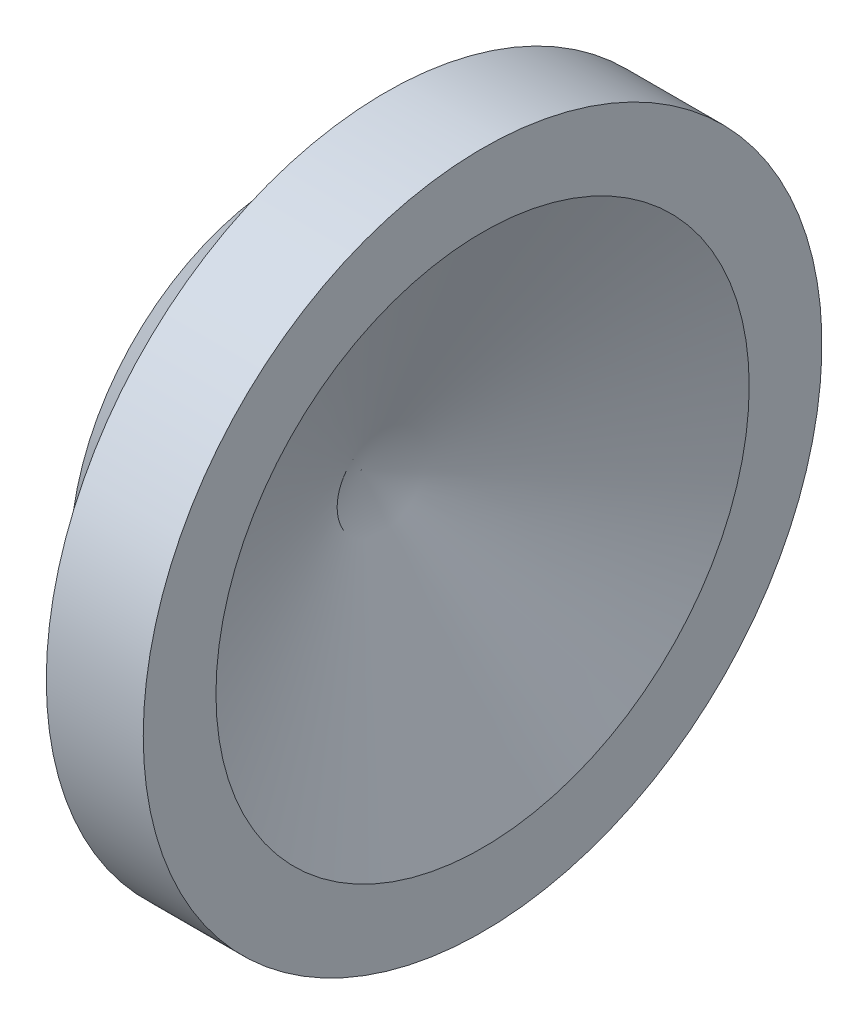
ISO-10303-21;
HEADER;
FILE_DESCRIPTION(('STEP AP214'),'2;1');
FILE_NAME('part.step','',(''),(''),'','','');
FILE_SCHEMA(('AUTOMOTIVE_DESIGN { 1 0 10303 214 1 1 1 1 }'));
ENDSEC;
DATA;
#1=APPLICATION_CONTEXT('core data for automotive mechanical design processes');
#2=APPLICATION_PROTOCOL_DEFINITION('international standard','automotive_design',2000,#1);
#3=PRODUCT_CONTEXT('',#1,'mechanical');
#4=PRODUCT('Part','Part','',(#3));
#5=PRODUCT_RELATED_PRODUCT_CATEGORY('part','',(#4));
#6=PRODUCT_DEFINITION_FORMATION('','',#4);
#7=PRODUCT_DEFINITION_CONTEXT('part definition',#1,'design');
#8=PRODUCT_DEFINITION('design','',#6,#7);
#9=PRODUCT_DEFINITION_SHAPE('','',#8);
#10=(LENGTH_UNIT() NAMED_UNIT(*) SI_UNIT(.MILLI.,.METRE.));
#11=(NAMED_UNIT(*) PLANE_ANGLE_UNIT() SI_UNIT($,.RADIAN.));
#12=(NAMED_UNIT(*) SI_UNIT($,.STERADIAN.) SOLID_ANGLE_UNIT());
#13=UNCERTAINTY_MEASURE_WITH_UNIT(LENGTH_MEASURE(1.E-05),#10,'distance_accuracy_value','');
#14=(GEOMETRIC_REPRESENTATION_CONTEXT(3) GLOBAL_UNCERTAINTY_ASSIGNED_CONTEXT((#13)) GLOBAL_UNIT_ASSIGNED_CONTEXT((#10,
#11,#12)) REPRESENTATION_CONTEXT('',''));
#15=CARTESIAN_POINT('',(0.,0.,0.));
#16=DIRECTION('',(0.,0.,1.));
#17=DIRECTION('',(1.,0.,0.));
#18=AXIS2_PLACEMENT_3D('',#15,#16,#17);
#19=CARTESIAN_POINT('',(0.,0.,1.5));
#20=DIRECTION('',(-1.,0.,0.));
#21=DIRECTION('',(0.,0.,1.));
#22=AXIS2_PLACEMENT_3D('',#19,#20,#21);
#23=PLANE('',#22);
#24=CARTESIAN_POINT('',(0.,0.,-2.));
#25=DIRECTION('',(-1.,0.,0.));
#26=DIRECTION('',(0.,0.,1.));
#27=AXIS2_PLACEMENT_3D('',#24,#25,#26);
#28=CIRCLE('',#27,3.5);
#29=CARTESIAN_POINT('',(0.,0.,1.5));
#30=VERTEX_POINT('',#29);
#31=EDGE_CURVE('E11',#30,#30,#28,.T.);
#32=ORIENTED_EDGE('',*,*,#31,.T.);
#33=EDGE_LOOP('',(#32));
#34=FACE_BOUND('',#33,.T.);
#35=CARTESIAN_POINT('',(0.,0.,-2.));
#36=DIRECTION('',(-1.,0.,0.));
#37=DIRECTION('',(0.,0.,1.));
#38=AXIS2_PLACEMENT_3D('',#35,#36,#37);
#39=CIRCLE('',#38,2.);
#40=CARTESIAN_POINT('',(0.,0.,0.));
#41=VERTEX_POINT('',#40);
#42=EDGE_CURVE('E65',#41,#41,#39,.T.);
#43=ORIENTED_EDGE('',*,*,#42,.F.);
#44=EDGE_LOOP('',(#43));
#45=FACE_BOUND('',#44,.T.);
#46=ADVANCED_FACE('F37',(#34,#45),#23,.T.);
#47=CARTESIAN_POINT('',(-1.,0.,-2.));
#48=DIRECTION('',(-1.,0.,0.));
#49=DIRECTION('',(0.,0.,1.));
#50=AXIS2_PLACEMENT_3D('',#47,#48,#49);
#51=CYLINDRICAL_SURFACE('',#50,3.5);
#52=CARTESIAN_POINT('',(1.,0.,-2.));
#53=DIRECTION('',(-1.,0.,0.));
#54=DIRECTION('',(0.,0.,1.));
#55=AXIS2_PLACEMENT_3D('',#52,#53,#54);
#56=CIRCLE('',#55,3.5);
#57=CARTESIAN_POINT('',(1.,0.,1.5));
#58=VERTEX_POINT('',#57);
#59=EDGE_CURVE('E43',#58,#58,#56,.T.);
#60=ORIENTED_EDGE('',*,*,#59,.T.);
#61=EDGE_LOOP('',(#60));
#62=FACE_BOUND('',#61,.T.);
#63=ORIENTED_EDGE('',*,*,#31,.F.);
#64=EDGE_LOOP('',(#63));
#65=FACE_BOUND('',#64,.T.);
#66=ADVANCED_FACE('F73',(#62,#65),#51,.T.);
#67=CARTESIAN_POINT('',(1.,0.,0.75));
#68=DIRECTION('',(1.,0.,0.));
#69=DIRECTION('',(0.,0.,-1.));
#70=AXIS2_PLACEMENT_3D('',#67,#68,#69);
#71=PLANE('',#70);
#72=CARTESIAN_POINT('',(1.,0.,-2.));
#73=DIRECTION('',(-1.,0.,0.));
#74=DIRECTION('',(0.,0.,1.));
#75=AXIS2_PLACEMENT_3D('',#72,#73,#74);
#76=CIRCLE('',#75,2.75);
#77=CARTESIAN_POINT('',(1.,0.,0.75));
#78=VERTEX_POINT('',#77);
#79=EDGE_CURVE('E54',#78,#78,#76,.T.);
#80=ORIENTED_EDGE('',*,*,#79,.T.);
#81=EDGE_LOOP('',(#80));
#82=FACE_BOUND('',#81,.T.);
#83=ORIENTED_EDGE('',*,*,#59,.F.);
#84=EDGE_LOOP('',(#83));
#85=FACE_BOUND('',#84,.T.);
#86=ADVANCED_FACE('F50',(#82,#85),#71,.T.);
#87=CARTESIAN_POINT('',(1.,0.,-2.));
#88=DIRECTION('',(1.,0.,0.));
#89=DIRECTION('',(0.,0.,-1.));
#90=AXIS2_PLACEMENT_3D('',#87,#88,#89);
#91=CONICAL_SURFACE('',#90,2.75,1.14416883366802);
#92=CARTESIAN_POINT('',(-0.25,0.,-2.));
#93=VERTEX_POINT('',#92);
#94=VERTEX_LOOP('',#93);
#95=FACE_BOUND('',#94,.T.);
#96=ORIENTED_EDGE('',*,*,#79,.F.);
#97=EDGE_LOOP('',(#96));
#98=FACE_BOUND('',#97,.T.);
#99=ADVANCED_FACE('F46',(#95,#98),#91,.F.);
#100=CARTESIAN_POINT('',(-1.,0.,0.25));
#101=DIRECTION('',(-1.,0.,0.));
#102=DIRECTION('',(0.,0.,1.));
#103=AXIS2_PLACEMENT_3D('',#100,#101,#102);
#104=PLANE('',#103);
#105=CARTESIAN_POINT('',(-1.,0.,-2.));
#106=DIRECTION('',(-1.,0.,0.));
#107=DIRECTION('',(0.,0.,1.));
#108=AXIS2_PLACEMENT_3D('',#105,#106,#107);
#109=CIRCLE('',#108,2.25);
#110=CARTESIAN_POINT('',(-1.,0.,0.25));
#111=VERTEX_POINT('',#110);
#112=EDGE_CURVE('E56',#111,#111,#109,.T.);
#113=ORIENTED_EDGE('',*,*,#112,.T.);
#114=EDGE_LOOP('',(#113));
#115=FACE_BOUND('',#114,.T.);
#116=ADVANCED_FACE('F49',(#115),#104,.T.);
#117=CARTESIAN_POINT('',(-1.,0.,-2.));
#118=DIRECTION('',(-1.,0.,0.));
#119=DIRECTION('',(0.,0.,1.));
#120=AXIS2_PLACEMENT_3D('',#117,#118,#119);
#121=CONICAL_SURFACE('',#120,2.25,0.785398163397454);
#122=CARTESIAN_POINT('',(-0.750000000000003,0.,-2.));
#123=DIRECTION('',(-1.,0.,0.));
#124=DIRECTION('',(0.,0.,1.));
#125=AXIS2_PLACEMENT_3D('',#122,#123,#124);
#126=CIRCLE('',#125,2.);
#127=CARTESIAN_POINT('',(-0.750000000000003,0.,0.));
#128=VERTEX_POINT('',#127);
#129=EDGE_CURVE('E60',#128,#128,#126,.T.);
#130=ORIENTED_EDGE('',*,*,#129,.T.);
#131=EDGE_LOOP('',(#130));
#132=FACE_BOUND('',#131,.T.);
#133=ORIENTED_EDGE('',*,*,#112,.F.);
#134=EDGE_LOOP('',(#133));
#135=FACE_BOUND('',#134,.T.);
#136=ADVANCED_FACE('F88',(#132,#135),#121,.T.);
#137=CARTESIAN_POINT('',(-1.,0.,-2.));
#138=DIRECTION('',(-1.,0.,0.));
#139=DIRECTION('',(0.,0.,1.));
#140=AXIS2_PLACEMENT_3D('',#137,#138,#139);
#141=CYLINDRICAL_SURFACE('',#140,2.);
#142=ORIENTED_EDGE('',*,*,#42,.T.);
#143=EDGE_LOOP('',(#142));
#144=FACE_BOUND('',#143,.T.);
#145=ORIENTED_EDGE('',*,*,#129,.F.);
#146=EDGE_LOOP('',(#145));
#147=FACE_BOUND('',#146,.T.);
#148=ADVANCED_FACE('F69',(#144,#147),#141,.T.);
#149=CLOSED_SHELL('',(#46,#66,#86,#99,#116,#136,#148));
#150=MANIFOLD_SOLID_BREP('B2',#149);
#151=ADVANCED_BREP_SHAPE_REPRESENTATION('',(#18,#150),#14);
#152=SHAPE_DEFINITION_REPRESENTATION(#9,#151);
ENDSEC;
END-ISO-10303-21;
